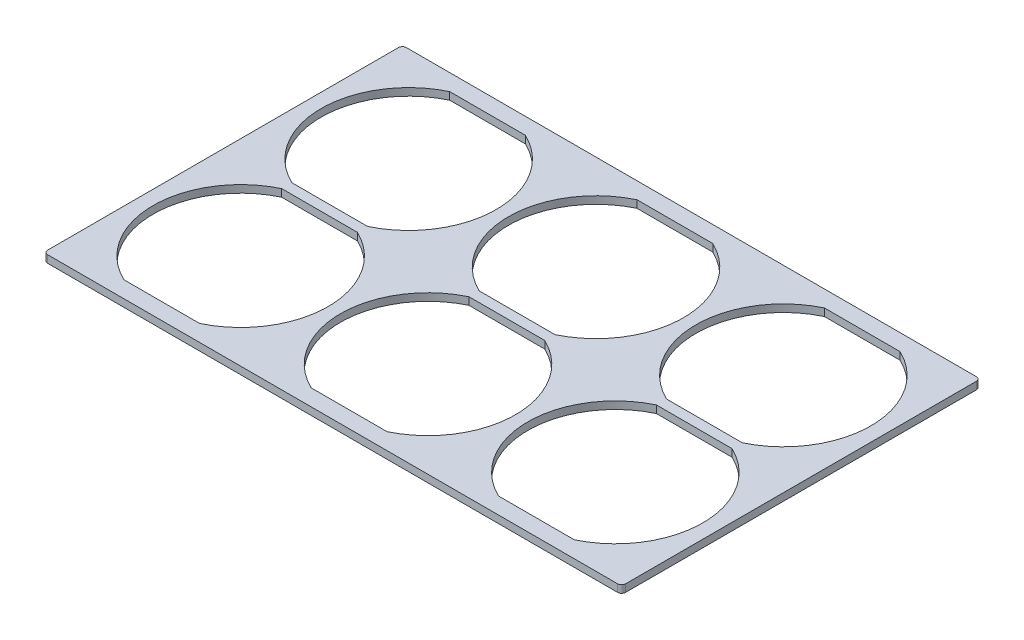
ISO-10303-21;
HEADER;
FILE_DESCRIPTION(('STEP AP214'),'2;1');
FILE_NAME('part.step','',(''),(''),'','','');
FILE_SCHEMA(('AUTOMOTIVE_DESIGN { 1 0 10303 214 1 1 1 1 }'));
ENDSEC;
DATA;
#1=APPLICATION_CONTEXT('core data for automotive mechanical design processes');
#2=APPLICATION_PROTOCOL_DEFINITION('international standard','automotive_design',2000,#1);
#3=PRODUCT_CONTEXT('',#1,'mechanical');
#4=PRODUCT('Part','Part','',(#3));
#5=PRODUCT_RELATED_PRODUCT_CATEGORY('part','',(#4));
#6=PRODUCT_DEFINITION_FORMATION('','',#4);
#7=PRODUCT_DEFINITION_CONTEXT('part definition',#1,'design');
#8=PRODUCT_DEFINITION('design','',#6,#7);
#9=PRODUCT_DEFINITION_SHAPE('','',#8);
#10=(LENGTH_UNIT() NAMED_UNIT(*) SI_UNIT(.MILLI.,.METRE.));
#11=(NAMED_UNIT(*) PLANE_ANGLE_UNIT() SI_UNIT($,.RADIAN.));
#12=(NAMED_UNIT(*) SI_UNIT($,.STERADIAN.) SOLID_ANGLE_UNIT());
#13=UNCERTAINTY_MEASURE_WITH_UNIT(LENGTH_MEASURE(1.E-05),#10,'distance_accuracy_value','');
#14=(GEOMETRIC_REPRESENTATION_CONTEXT(3) GLOBAL_UNCERTAINTY_ASSIGNED_CONTEXT((#13)) GLOBAL_UNIT_ASSIGNED_CONTEXT((#10,
#11,#12)) REPRESENTATION_CONTEXT('',''));
#15=CARTESIAN_POINT('',(0.,0.,0.));
#16=DIRECTION('',(0.,0.,1.));
#17=DIRECTION('',(1.,0.,0.));
#18=AXIS2_PLACEMENT_3D('',#15,#16,#17);
#19=CARTESIAN_POINT('',(184.15,4.7625,114.3));
#20=DIRECTION('',(-1.,0.,0.));
#21=DIRECTION('',(0.,0.,1.));
#22=AXIS2_PLACEMENT_3D('',#19,#20,#21);
#23=PLANE('',#22);
#24=DIRECTION('',(0.,0.,-1.));
#25=VECTOR('',#24,1.);
#26=CARTESIAN_POINT('',(184.15,4.7625,114.3));
#27=LINE('',#26,#25);
#28=CARTESIAN_POINT('',(184.15,4.7625,111.76));
#29=VERTEX_POINT('',#28);
#30=CARTESIAN_POINT('',(184.15,4.7625,-111.76));
#31=VERTEX_POINT('',#30);
#32=EDGE_CURVE('E447',#29,#31,#27,.T.);
#33=ORIENTED_EDGE('',*,*,#32,.F.);
#34=DIRECTION('',(0.,-1.,0.));
#35=VECTOR('',#34,1.);
#36=CARTESIAN_POINT('',(184.15,4.7625,111.76));
#37=LINE('',#36,#35);
#38=CARTESIAN_POINT('',(184.15,0.,111.76));
#39=VERTEX_POINT('',#38);
#40=EDGE_CURVE('E494',#29,#39,#37,.T.);
#41=ORIENTED_EDGE('',*,*,#40,.T.);
#42=DIRECTION('',(0.,0.,-1.));
#43=VECTOR('',#42,1.);
#44=CARTESIAN_POINT('',(184.15,0.,114.3));
#45=LINE('',#44,#43);
#46=CARTESIAN_POINT('',(184.15,0.,-111.76));
#47=VERTEX_POINT('',#46);
#48=EDGE_CURVE('E440',#39,#47,#45,.T.);
#49=ORIENTED_EDGE('',*,*,#48,.T.);
#50=DIRECTION('',(0.,-1.,0.));
#51=VECTOR('',#50,1.);
#52=CARTESIAN_POINT('',(184.15,4.7625,-111.76));
#53=LINE('',#52,#51);
#54=EDGE_CURVE('E492',#47,#31,#53,.F.);
#55=ORIENTED_EDGE('',*,*,#54,.T.);
#56=EDGE_LOOP('',(#33,#41,#49,#55));
#57=FACE_BOUND('',#56,.T.);
#58=ADVANCED_FACE('F33',(#57),#23,.F.);
#59=CARTESIAN_POINT('',(-184.15,4.7625,-114.3));
#60=DIRECTION('',(0.,0.,1.));
#61=DIRECTION('',(1.,0.,0.));
#62=AXIS2_PLACEMENT_3D('',#59,#60,#61);
#63=PLANE('',#62);
#64=DIRECTION('',(-1.,0.,0.));
#65=VECTOR('',#64,1.);
#66=CARTESIAN_POINT('',(-184.15,4.7625,-114.3));
#67=LINE('',#66,#65);
#68=CARTESIAN_POINT('',(181.61,4.7625,-114.3));
#69=VERTEX_POINT('',#68);
#70=CARTESIAN_POINT('',(-181.61,4.7625,-114.3));
#71=VERTEX_POINT('',#70);
#72=EDGE_CURVE('E449',#69,#71,#67,.T.);
#73=ORIENTED_EDGE('',*,*,#72,.F.);
#74=DIRECTION('',(0.,-1.,0.));
#75=VECTOR('',#74,1.);
#76=CARTESIAN_POINT('',(181.61,4.7625,-114.3));
#77=LINE('',#76,#75);
#78=CARTESIAN_POINT('',(181.61,0.,-114.3));
#79=VERTEX_POINT('',#78);
#80=EDGE_CURVE('E11',#69,#79,#77,.T.);
#81=ORIENTED_EDGE('',*,*,#80,.T.);
#82=DIRECTION('',(-1.,0.,0.));
#83=VECTOR('',#82,1.);
#84=CARTESIAN_POINT('',(-184.15,0.,-114.3));
#85=LINE('',#84,#83);
#86=CARTESIAN_POINT('',(-181.61,0.,-114.3));
#87=VERTEX_POINT('',#86);
#88=EDGE_CURVE('E461',#79,#87,#85,.T.);
#89=ORIENTED_EDGE('',*,*,#88,.T.);
#90=DIRECTION('',(0.,-1.,0.));
#91=VECTOR('',#90,1.);
#92=CARTESIAN_POINT('',(-181.61,4.7625,-114.3));
#93=LINE('',#92,#91);
#94=EDGE_CURVE('E41',#87,#71,#93,.F.);
#95=ORIENTED_EDGE('',*,*,#94,.T.);
#96=EDGE_LOOP('',(#73,#81,#89,#95));
#97=FACE_BOUND('',#96,.T.);
#98=ADVANCED_FACE('F510',(#97),#63,.F.);
#99=CARTESIAN_POINT('',(-184.15,4.7625,114.3));
#100=DIRECTION('',(1.,0.,0.));
#101=DIRECTION('',(0.,0.,-1.));
#102=AXIS2_PLACEMENT_3D('',#99,#100,#101);
#103=PLANE('',#102);
#104=DIRECTION('',(0.,0.,1.));
#105=VECTOR('',#104,1.);
#106=CARTESIAN_POINT('',(-184.15,0.,114.3));
#107=LINE('',#106,#105);
#108=CARTESIAN_POINT('',(-184.15,0.,-111.76));
#109=VERTEX_POINT('',#108);
#110=CARTESIAN_POINT('',(-184.15,0.,111.76));
#111=VERTEX_POINT('',#110);
#112=EDGE_CURVE('E463',#109,#111,#107,.T.);
#113=ORIENTED_EDGE('',*,*,#112,.T.);
#114=DIRECTION('',(0.,-1.,0.));
#115=VECTOR('',#114,1.);
#116=CARTESIAN_POINT('',(-184.15,4.7625,111.76));
#117=LINE('',#116,#115);
#118=CARTESIAN_POINT('',(-184.15,4.7625,111.76));
#119=VERTEX_POINT('',#118);
#120=EDGE_CURVE('E483',#111,#119,#117,.F.);
#121=ORIENTED_EDGE('',*,*,#120,.T.);
#122=DIRECTION('',(0.,0.,1.));
#123=VECTOR('',#122,1.);
#124=CARTESIAN_POINT('',(-184.15,4.7625,114.3));
#125=LINE('',#124,#123);
#126=CARTESIAN_POINT('',(-184.15,4.7625,-111.76));
#127=VERTEX_POINT('',#126);
#128=EDGE_CURVE('E452',#127,#119,#125,.T.);
#129=ORIENTED_EDGE('',*,*,#128,.F.);
#130=DIRECTION('',(0.,-1.,0.));
#131=VECTOR('',#130,1.);
#132=CARTESIAN_POINT('',(-184.15,4.7625,-111.76));
#133=LINE('',#132,#131);
#134=EDGE_CURVE('E480',#127,#109,#133,.T.);
#135=ORIENTED_EDGE('',*,*,#134,.T.);
#136=EDGE_LOOP('',(#113,#121,#129,#135));
#137=FACE_BOUND('',#136,.T.);
#138=ADVANCED_FACE('F517',(#137),#103,.F.);
#139=CARTESIAN_POINT('',(-184.15,4.7625,114.3));
#140=DIRECTION('',(0.,0.,-1.));
#141=DIRECTION('',(-1.,0.,0.));
#142=AXIS2_PLACEMENT_3D('',#139,#140,#141);
#143=PLANE('',#142);
#144=DIRECTION('',(1.,0.,0.));
#145=VECTOR('',#144,1.);
#146=CARTESIAN_POINT('',(-184.15,4.7625,114.3));
#147=LINE('',#146,#145);
#148=CARTESIAN_POINT('',(-181.61,4.7625,114.3));
#149=VERTEX_POINT('',#148);
#150=CARTESIAN_POINT('',(181.61,4.7625,114.3));
#151=VERTEX_POINT('',#150);
#152=EDGE_CURVE('E455',#149,#151,#147,.T.);
#153=ORIENTED_EDGE('',*,*,#152,.F.);
#154=DIRECTION('',(0.,-1.,0.));
#155=VECTOR('',#154,1.);
#156=CARTESIAN_POINT('',(-181.61,4.7625,114.3));
#157=LINE('',#156,#155);
#158=CARTESIAN_POINT('',(-181.61,0.,114.3));
#159=VERTEX_POINT('',#158);
#160=EDGE_CURVE('E469',#149,#159,#157,.T.);
#161=ORIENTED_EDGE('',*,*,#160,.T.);
#162=DIRECTION('',(1.,0.,0.));
#163=VECTOR('',#162,1.);
#164=CARTESIAN_POINT('',(-184.15,0.,114.3));
#165=LINE('',#164,#163);
#166=CARTESIAN_POINT('',(181.61,0.,114.3));
#167=VERTEX_POINT('',#166);
#168=EDGE_CURVE('E450',#159,#167,#165,.T.);
#169=ORIENTED_EDGE('',*,*,#168,.T.);
#170=DIRECTION('',(0.,-1.,0.));
#171=VECTOR('',#170,1.);
#172=CARTESIAN_POINT('',(181.61,4.7625,114.3));
#173=LINE('',#172,#171);
#174=EDGE_CURVE('E458',#167,#151,#173,.F.);
#175=ORIENTED_EDGE('',*,*,#174,.T.);
#176=EDGE_LOOP('',(#153,#161,#169,#175));
#177=FACE_BOUND('',#176,.T.);
#178=ADVANCED_FACE('F525',(#177),#143,.F.);
#179=CARTESIAN_POINT('',(0.,4.7625,0.));
#180=DIRECTION('',(0.,-1.,0.));
#181=DIRECTION('',(0.,0.,-1.));
#182=AXIS2_PLACEMENT_3D('',#179,#180,#181);
#183=PLANE('',#182);
#184=DIRECTION('',(-1.,0.,0.));
#185=VECTOR('',#184,1.);
#186=CARTESIAN_POINT('',(-95.2266255193019,4.7625,-3.24545465410517));
#187=LINE('',#186,#185);
#188=CARTESIAN_POINT('',(-95.2266255193019,4.7625,-3.24545465410517));
#189=VERTEX_POINT('',#188);
#190=CARTESIAN_POINT('',(-143.533374480698,4.7625,-3.24545465410517));
#191=VERTEX_POINT('',#190);
#192=EDGE_CURVE('E362',#189,#191,#187,.T.);
#193=ORIENTED_EDGE('',*,*,#192,.T.);
#194=CARTESIAN_POINT('',(-119.38,4.7625,-53.5305000000017));
#195=DIRECTION('',(0.,-1.,0.));
#196=DIRECTION('',(0.,0.,-1.));
#197=AXIS2_PLACEMENT_3D('',#194,#195,#196);
#198=CIRCLE('',#197,55.7850453458963);
#199=CARTESIAN_POINT('',(-143.533374480698,4.7625,-103.815545345898));
#200=VERTEX_POINT('',#199);
#201=EDGE_CURVE('E352',#191,#200,#198,.T.);
#202=ORIENTED_EDGE('',*,*,#201,.T.);
#203=DIRECTION('',(1.,0.,0.));
#204=VECTOR('',#203,1.);
#205=CARTESIAN_POINT('',(-95.2266255193019,4.7625,-103.815545345898));
#206=LINE('',#205,#204);
#207=CARTESIAN_POINT('',(-95.2266255193019,4.7625,-103.815545345898));
#208=VERTEX_POINT('',#207);
#209=EDGE_CURVE('E355',#200,#208,#206,.T.);
#210=ORIENTED_EDGE('',*,*,#209,.T.);
#211=CARTESIAN_POINT('',(-119.38,4.7625,-53.5305000000017));
#212=DIRECTION('',(0.,-1.,0.));
#213=DIRECTION('',(0.,0.,-1.));
#214=AXIS2_PLACEMENT_3D('',#211,#212,#213);
#215=CIRCLE('',#214,55.7850453458963);
#216=EDGE_CURVE('E359',#208,#189,#215,.T.);
#217=ORIENTED_EDGE('',*,*,#216,.T.);
#218=EDGE_LOOP('',(#193,#202,#210,#217));
#219=FACE_BOUND('',#218,.T.);
#220=DIRECTION('',(-1.,0.,0.));
#221=VECTOR('',#220,1.);
#222=CARTESIAN_POINT('',(24.1533744806981,4.7625,-3.24545465410433));
#223=LINE('',#222,#221);
#224=CARTESIAN_POINT('',(24.1533744806981,4.7625,-3.24545465410434));
#225=VERTEX_POINT('',#224);
#226=CARTESIAN_POINT('',(-24.1533744806982,4.7625,-3.24545465410433));
#227=VERTEX_POINT('',#226);
#228=EDGE_CURVE('E330',#225,#227,#223,.T.);
#229=ORIENTED_EDGE('',*,*,#228,.T.);
#230=CARTESIAN_POINT('',(0.,4.7625,-53.5305000000008));
#231=DIRECTION('',(0.,-1.,0.));
#232=DIRECTION('',(0.,0.,-1.));
#233=AXIS2_PLACEMENT_3D('',#230,#231,#232);
#234=CIRCLE('',#233,55.7850453458963);
#235=CARTESIAN_POINT('',(-24.1533744806982,4.7625,-103.815545345897));
#236=VERTEX_POINT('',#235);
#237=EDGE_CURVE('E320',#227,#236,#234,.T.);
#238=ORIENTED_EDGE('',*,*,#237,.T.);
#239=DIRECTION('',(1.,0.,0.));
#240=VECTOR('',#239,1.);
#241=CARTESIAN_POINT('',(24.1533744806981,4.7625,-103.815545345897));
#242=LINE('',#241,#240);
#243=CARTESIAN_POINT('',(24.1533744806981,4.7625,-103.815545345897));
#244=VERTEX_POINT('',#243);
#245=EDGE_CURVE('E323',#236,#244,#242,.T.);
#246=ORIENTED_EDGE('',*,*,#245,.T.);
#247=CARTESIAN_POINT('',(0.,4.7625,-53.5305000000008));
#248=DIRECTION('',(0.,-1.,0.));
#249=DIRECTION('',(0.,0.,-1.));
#250=AXIS2_PLACEMENT_3D('',#247,#248,#249);
#251=CIRCLE('',#250,55.7850453458963);
#252=EDGE_CURVE('E327',#244,#225,#251,.T.);
#253=ORIENTED_EDGE('',*,*,#252,.T.);
#254=EDGE_LOOP('',(#229,#238,#246,#253));
#255=FACE_BOUND('',#254,.T.);
#256=DIRECTION('',(-1.,0.,0.));
#257=VECTOR('',#256,1.);
#258=CARTESIAN_POINT('',(-95.2266255193018,4.7625,103.815545345896));
#259=LINE('',#258,#257);
#260=CARTESIAN_POINT('',(-95.2266255193018,4.7625,103.815545345896));
#261=VERTEX_POINT('',#260);
#262=CARTESIAN_POINT('',(-143.533374480698,4.7625,103.815545345896));
#263=VERTEX_POINT('',#262);
#264=EDGE_CURVE('E298',#261,#263,#259,.T.);
#265=ORIENTED_EDGE('',*,*,#264,.T.);
#266=CARTESIAN_POINT('',(-119.38,4.7625,53.5304999999991));
#267=DIRECTION('',(0.,-1.,0.));
#268=DIRECTION('',(0.,0.,-1.));
#269=AXIS2_PLACEMENT_3D('',#266,#267,#268);
#270=CIRCLE('',#269,55.7850453458963);
#271=CARTESIAN_POINT('',(-143.533374480698,4.7625,3.24545465410263));
#272=VERTEX_POINT('',#271);
#273=EDGE_CURVE('E288',#263,#272,#270,.T.);
#274=ORIENTED_EDGE('',*,*,#273,.T.);
#275=DIRECTION('',(1.,0.,0.));
#276=VECTOR('',#275,1.);
#277=CARTESIAN_POINT('',(-95.2266255193018,4.7625,3.24545465410263));
#278=LINE('',#277,#276);
#279=CARTESIAN_POINT('',(-95.2266255193018,4.7625,3.24545465410263));
#280=VERTEX_POINT('',#279);
#281=EDGE_CURVE('E291',#272,#280,#278,.T.);
#282=ORIENTED_EDGE('',*,*,#281,.T.);
#283=CARTESIAN_POINT('',(-119.38,4.7625,53.5304999999991));
#284=DIRECTION('',(0.,-1.,0.));
#285=DIRECTION('',(0.,0.,-1.));
#286=AXIS2_PLACEMENT_3D('',#283,#284,#285);
#287=CIRCLE('',#286,55.7850453458963);
#288=EDGE_CURVE('E295',#280,#261,#287,.T.);
#289=ORIENTED_EDGE('',*,*,#288,.T.);
#290=EDGE_LOOP('',(#265,#274,#282,#289));
#291=FACE_BOUND('',#290,.T.);
#292=DIRECTION('',(-1.,0.,0.));
#293=VECTOR('',#292,1.);
#294=CARTESIAN_POINT('',(24.1533744806981,4.7625,103.815545345896));
#295=LINE('',#294,#293);
#296=CARTESIAN_POINT('',(24.1533744806981,4.7625,103.815545345896));
#297=VERTEX_POINT('',#296);
#298=CARTESIAN_POINT('',(-24.1533744806982,4.7625,103.815545345896));
#299=VERTEX_POINT('',#298);
#300=EDGE_CURVE('E255',#297,#299,#295,.T.);
#301=ORIENTED_EDGE('',*,*,#300,.T.);
#302=CARTESIAN_POINT('',(0.,4.7625,53.5304999999992));
#303=DIRECTION('',(0.,-1.,0.));
#304=DIRECTION('',(0.,0.,-1.));
#305=AXIS2_PLACEMENT_3D('',#302,#303,#304);
#306=CIRCLE('',#305,55.7850453458963);
#307=CARTESIAN_POINT('',(-24.1533744806982,4.7625,3.24545465410268));
#308=VERTEX_POINT('',#307);
#309=EDGE_CURVE('E247',#299,#308,#306,.T.);
#310=ORIENTED_EDGE('',*,*,#309,.T.);
#311=DIRECTION('',(1.,0.,0.));
#312=VECTOR('',#311,1.);
#313=CARTESIAN_POINT('',(24.1533744806981,4.7625,3.24545465410268));
#314=LINE('',#313,#312);
#315=CARTESIAN_POINT('',(24.1533744806981,4.7625,3.24545465410268));
#316=VERTEX_POINT('',#315);
#317=EDGE_CURVE('E259',#308,#316,#314,.T.);
#318=ORIENTED_EDGE('',*,*,#317,.T.);
#319=CARTESIAN_POINT('',(0.,4.7625,53.5304999999992));
#320=DIRECTION('',(0.,-1.,0.));
#321=DIRECTION('',(0.,0.,-1.));
#322=AXIS2_PLACEMENT_3D('',#319,#320,#321);
#323=CIRCLE('',#322,55.7850453458963);
#324=EDGE_CURVE('E263',#316,#297,#323,.T.);
#325=ORIENTED_EDGE('',*,*,#324,.T.);
#326=EDGE_LOOP('',(#301,#310,#318,#325));
#327=FACE_BOUND('',#326,.T.);
#328=DIRECTION('',(-1.,0.,0.));
#329=VECTOR('',#328,1.);
#330=CARTESIAN_POINT('',(143.533374480698,4.7625,103.815545345896));
#331=LINE('',#330,#329);
#332=CARTESIAN_POINT('',(143.533374480698,4.7625,103.815545345896));
#333=VERTEX_POINT('',#332);
#334=CARTESIAN_POINT('',(95.2266255193018,4.7625,103.815545345896));
#335=VERTEX_POINT('',#334);
#336=EDGE_CURVE('E393',#333,#335,#331,.T.);
#337=ORIENTED_EDGE('',*,*,#336,.T.);
#338=CARTESIAN_POINT('',(119.38,4.7625,53.5305));
#339=DIRECTION('',(0.,-1.,0.));
#340=DIRECTION('',(0.,0.,-1.));
#341=AXIS2_PLACEMENT_3D('',#338,#339,#340);
#342=CIRCLE('',#341,55.7850453458963);
#343=CARTESIAN_POINT('',(95.2266255193018,4.7625,3.24545465410352));
#344=VERTEX_POINT('',#343);
#345=EDGE_CURVE('E383',#335,#344,#342,.T.);
#346=ORIENTED_EDGE('',*,*,#345,.T.);
#347=DIRECTION('',(1.,0.,0.));
#348=VECTOR('',#347,1.);
#349=CARTESIAN_POINT('',(143.533374480698,4.7625,3.24545465410352));
#350=LINE('',#349,#348);
#351=CARTESIAN_POINT('',(143.533374480698,4.7625,3.24545465410352));
#352=VERTEX_POINT('',#351);
#353=EDGE_CURVE('E386',#344,#352,#350,.T.);
#354=ORIENTED_EDGE('',*,*,#353,.T.);
#355=CARTESIAN_POINT('',(119.38,4.7625,53.5305));
#356=DIRECTION('',(0.,-1.,0.));
#357=DIRECTION('',(0.,0.,-1.));
#358=AXIS2_PLACEMENT_3D('',#355,#356,#357);
#359=CIRCLE('',#358,55.7850453458963);
#360=EDGE_CURVE('E390',#352,#333,#359,.T.);
#361=ORIENTED_EDGE('',*,*,#360,.T.);
#362=EDGE_LOOP('',(#337,#346,#354,#361));
#363=FACE_BOUND('',#362,.T.);
#364=DIRECTION('',(-1.,0.,0.));
#365=VECTOR('',#364,1.);
#366=CARTESIAN_POINT('',(143.533374480698,4.7625,-3.24545465410434));
#367=LINE('',#366,#365);
#368=CARTESIAN_POINT('',(143.533374480698,4.7625,-3.24545465410435));
#369=VERTEX_POINT('',#368);
#370=CARTESIAN_POINT('',(95.2266255193014,4.7625,-3.24545465410434));
#371=VERTEX_POINT('',#370);
#372=EDGE_CURVE('E425',#369,#371,#367,.T.);
#373=ORIENTED_EDGE('',*,*,#372,.T.);
#374=CARTESIAN_POINT('',(119.38,4.7625,-53.5305000000008));
#375=DIRECTION('',(0.,-1.,0.));
#376=DIRECTION('',(0.,0.,-1.));
#377=AXIS2_PLACEMENT_3D('',#374,#375,#376);
#378=CIRCLE('',#377,55.7850453458963);
#379=CARTESIAN_POINT('',(95.2266255193014,4.7625,-103.815545345897));
#380=VERTEX_POINT('',#379);
#381=EDGE_CURVE('E415',#371,#380,#378,.T.);
#382=ORIENTED_EDGE('',*,*,#381,.T.);
#383=DIRECTION('',(1.,0.,0.));
#384=VECTOR('',#383,1.);
#385=CARTESIAN_POINT('',(143.533374480698,4.7625,-103.815545345897));
#386=LINE('',#385,#384);
#387=CARTESIAN_POINT('',(143.533374480698,4.7625,-103.815545345897));
#388=VERTEX_POINT('',#387);
#389=EDGE_CURVE('E418',#380,#388,#386,.T.);
#390=ORIENTED_EDGE('',*,*,#389,.T.);
#391=CARTESIAN_POINT('',(119.38,4.7625,-53.5305000000008));
#392=DIRECTION('',(0.,-1.,0.));
#393=DIRECTION('',(0.,0.,-1.));
#394=AXIS2_PLACEMENT_3D('',#391,#392,#393);
#395=CIRCLE('',#394,55.7850453458963);
#396=EDGE_CURVE('E422',#388,#369,#395,.T.);
#397=ORIENTED_EDGE('',*,*,#396,.T.);
#398=EDGE_LOOP('',(#373,#382,#390,#397));
#399=FACE_BOUND('',#398,.T.);
#400=ORIENTED_EDGE('',*,*,#128,.T.);
#401=CARTESIAN_POINT('',(-181.61,4.7625,111.76));
#402=DIRECTION('',(0.,-1.,0.));
#403=DIRECTION('',(0.,0.,-1.));
#404=AXIS2_PLACEMENT_3D('',#401,#402,#403);
#405=CIRCLE('',#404,2.54);
#406=EDGE_CURVE('E490',#119,#149,#405,.F.);
#407=ORIENTED_EDGE('',*,*,#406,.T.);
#408=ORIENTED_EDGE('',*,*,#152,.T.);
#409=CARTESIAN_POINT('',(181.61,4.7625,111.76));
#410=DIRECTION('',(0.,-1.,0.));
#411=DIRECTION('',(0.,0.,-1.));
#412=AXIS2_PLACEMENT_3D('',#409,#410,#411);
#413=CIRCLE('',#412,2.54);
#414=EDGE_CURVE('E488',#151,#29,#413,.F.);
#415=ORIENTED_EDGE('',*,*,#414,.T.);
#416=ORIENTED_EDGE('',*,*,#32,.T.);
#417=CARTESIAN_POINT('',(181.61,4.7625,-111.76));
#418=DIRECTION('',(0.,-1.,0.));
#419=DIRECTION('',(0.,0.,-1.));
#420=AXIS2_PLACEMENT_3D('',#417,#418,#419);
#421=CIRCLE('',#420,2.54);
#422=EDGE_CURVE('E54',#31,#69,#421,.F.);
#423=ORIENTED_EDGE('',*,*,#422,.T.);
#424=ORIENTED_EDGE('',*,*,#72,.T.);
#425=CARTESIAN_POINT('',(-181.61,4.7625,-111.76));
#426=DIRECTION('',(0.,-1.,0.));
#427=DIRECTION('',(0.,0.,-1.));
#428=AXIS2_PLACEMENT_3D('',#425,#426,#427);
#429=CIRCLE('',#428,2.54);
#430=EDGE_CURVE('E485',#71,#127,#429,.F.);
#431=ORIENTED_EDGE('',*,*,#430,.T.);
#432=EDGE_LOOP('',(#400,#407,#408,#415,#416,#423,#424,#431));
#433=FACE_BOUND('',#432,.T.);
#434=ADVANCED_FACE('F265',(#219,#255,#291,#327,#363,#399,#433),#183,.F.);
#435=CARTESIAN_POINT('',(0.,0.,0.));
#436=DIRECTION('',(0.,-1.,0.));
#437=DIRECTION('',(0.,0.,-1.));
#438=AXIS2_PLACEMENT_3D('',#435,#436,#437);
#439=PLANE('',#438);
#440=CARTESIAN_POINT('',(-119.38,0.,-53.5305000000017));
#441=DIRECTION('',(0.,-1.,0.));
#442=DIRECTION('',(0.,0.,-1.));
#443=AXIS2_PLACEMENT_3D('',#440,#441,#442);
#444=CIRCLE('',#443,55.7850453458963);
#445=CARTESIAN_POINT('',(-143.533374480698,0.,-3.24545465410517));
#446=VERTEX_POINT('',#445);
#447=CARTESIAN_POINT('',(-143.533374480698,0.,-103.815545345898));
#448=VERTEX_POINT('',#447);
#449=EDGE_CURVE('E366',#446,#448,#444,.T.);
#450=ORIENTED_EDGE('',*,*,#449,.F.);
#451=DIRECTION('',(-1.,0.,0.));
#452=VECTOR('',#451,1.);
#453=CARTESIAN_POINT('',(-95.2266255193019,0.,-3.24545465410517));
#454=LINE('',#453,#452);
#455=CARTESIAN_POINT('',(-95.2266255193019,0.,-3.24545465410517));
#456=VERTEX_POINT('',#455);
#457=EDGE_CURVE('E356',#456,#446,#454,.T.);
#458=ORIENTED_EDGE('',*,*,#457,.F.);
#459=CARTESIAN_POINT('',(-119.38,0.,-53.5305000000017));
#460=DIRECTION('',(0.,-1.,0.));
#461=DIRECTION('',(0.,0.,-1.));
#462=AXIS2_PLACEMENT_3D('',#459,#460,#461);
#463=CIRCLE('',#462,55.7850453458963);
#464=CARTESIAN_POINT('',(-95.2266255193019,0.,-103.815545345898));
#465=VERTEX_POINT('',#464);
#466=EDGE_CURVE('E371',#465,#456,#463,.T.);
#467=ORIENTED_EDGE('',*,*,#466,.F.);
#468=DIRECTION('',(1.,0.,0.));
#469=VECTOR('',#468,1.);
#470=CARTESIAN_POINT('',(-95.2266255193019,0.,-103.815545345898));
#471=LINE('',#470,#469);
#472=EDGE_CURVE('E368',#448,#465,#471,.T.);
#473=ORIENTED_EDGE('',*,*,#472,.F.);
#474=EDGE_LOOP('',(#450,#458,#467,#473));
#475=FACE_BOUND('',#474,.T.);
#476=CARTESIAN_POINT('',(0.,0.,-53.5305000000008));
#477=DIRECTION('',(0.,-1.,0.));
#478=DIRECTION('',(0.,0.,-1.));
#479=AXIS2_PLACEMENT_3D('',#476,#477,#478);
#480=CIRCLE('',#479,55.7850453458963);
#481=CARTESIAN_POINT('',(-24.1533744806982,0.,-3.24545465410433));
#482=VERTEX_POINT('',#481);
#483=CARTESIAN_POINT('',(-24.1533744806982,0.,-103.815545345897));
#484=VERTEX_POINT('',#483);
#485=EDGE_CURVE('E334',#482,#484,#480,.T.);
#486=ORIENTED_EDGE('',*,*,#485,.F.);
#487=DIRECTION('',(-1.,0.,0.));
#488=VECTOR('',#487,1.);
#489=CARTESIAN_POINT('',(24.1533744806981,0.,-3.24545465410433));
#490=LINE('',#489,#488);
#491=CARTESIAN_POINT('',(24.1533744806981,0.,-3.24545465410434));
#492=VERTEX_POINT('',#491);
#493=EDGE_CURVE('E324',#492,#482,#490,.T.);
#494=ORIENTED_EDGE('',*,*,#493,.F.);
#495=CARTESIAN_POINT('',(0.,0.,-53.5305000000008));
#496=DIRECTION('',(0.,-1.,0.));
#497=DIRECTION('',(0.,0.,-1.));
#498=AXIS2_PLACEMENT_3D('',#495,#496,#497);
#499=CIRCLE('',#498,55.7850453458963);
#500=CARTESIAN_POINT('',(24.1533744806981,0.,-103.815545345897));
#501=VERTEX_POINT('',#500);
#502=EDGE_CURVE('E340',#501,#492,#499,.T.);
#503=ORIENTED_EDGE('',*,*,#502,.F.);
#504=DIRECTION('',(1.,0.,0.));
#505=VECTOR('',#504,1.);
#506=CARTESIAN_POINT('',(24.1533744806981,0.,-103.815545345897));
#507=LINE('',#506,#505);
#508=EDGE_CURVE('E336',#484,#501,#507,.T.);
#509=ORIENTED_EDGE('',*,*,#508,.F.);
#510=EDGE_LOOP('',(#486,#494,#503,#509));
#511=FACE_BOUND('',#510,.T.);
#512=CARTESIAN_POINT('',(-119.38,0.,53.5304999999991));
#513=DIRECTION('',(0.,-1.,0.));
#514=DIRECTION('',(0.,0.,-1.));
#515=AXIS2_PLACEMENT_3D('',#512,#513,#514);
#516=CIRCLE('',#515,55.7850453458963);
#517=CARTESIAN_POINT('',(-143.533374480698,0.,103.815545345896));
#518=VERTEX_POINT('',#517);
#519=CARTESIAN_POINT('',(-143.533374480698,0.,3.24545465410263));
#520=VERTEX_POINT('',#519);
#521=EDGE_CURVE('E302',#518,#520,#516,.T.);
#522=ORIENTED_EDGE('',*,*,#521,.F.);
#523=DIRECTION('',(-1.,0.,0.));
#524=VECTOR('',#523,1.);
#525=CARTESIAN_POINT('',(-95.2266255193018,0.,103.815545345896));
#526=LINE('',#525,#524);
#527=CARTESIAN_POINT('',(-95.2266255193018,0.,103.815545345896));
#528=VERTEX_POINT('',#527);
#529=EDGE_CURVE('E292',#528,#518,#526,.T.);
#530=ORIENTED_EDGE('',*,*,#529,.F.);
#531=CARTESIAN_POINT('',(-119.38,0.,53.5304999999991));
#532=DIRECTION('',(0.,-1.,0.));
#533=DIRECTION('',(0.,0.,-1.));
#534=AXIS2_PLACEMENT_3D('',#531,#532,#533);
#535=CIRCLE('',#534,55.7850453458963);
#536=CARTESIAN_POINT('',(-95.2266255193018,0.,3.24545465410263));
#537=VERTEX_POINT('',#536);
#538=EDGE_CURVE('E308',#537,#528,#535,.T.);
#539=ORIENTED_EDGE('',*,*,#538,.F.);
#540=DIRECTION('',(1.,0.,0.));
#541=VECTOR('',#540,1.);
#542=CARTESIAN_POINT('',(-95.2266255193018,0.,3.24545465410263));
#543=LINE('',#542,#541);
#544=EDGE_CURVE('E304',#520,#537,#543,.T.);
#545=ORIENTED_EDGE('',*,*,#544,.F.);
#546=EDGE_LOOP('',(#522,#530,#539,#545));
#547=FACE_BOUND('',#546,.T.);
#548=CARTESIAN_POINT('',(0.,0.,53.5304999999992));
#549=DIRECTION('',(0.,-1.,0.));
#550=DIRECTION('',(0.,0.,-1.));
#551=AXIS2_PLACEMENT_3D('',#548,#549,#550);
#552=CIRCLE('',#551,55.7850453458963);
#553=CARTESIAN_POINT('',(-24.1533744806982,0.,103.815545345896));
#554=VERTEX_POINT('',#553);
#555=CARTESIAN_POINT('',(-24.1533744806982,0.,3.24545465410268));
#556=VERTEX_POINT('',#555);
#557=EDGE_CURVE('E250',#554,#556,#552,.T.);
#558=ORIENTED_EDGE('',*,*,#557,.F.);
#559=DIRECTION('',(-1.,0.,0.));
#560=VECTOR('',#559,1.);
#561=CARTESIAN_POINT('',(24.1533744806981,0.,103.815545345896));
#562=LINE('',#561,#560);
#563=CARTESIAN_POINT('',(24.1533744806981,0.,103.815545345896));
#564=VERTEX_POINT('',#563);
#565=EDGE_CURVE('E268',#564,#554,#562,.T.);
#566=ORIENTED_EDGE('',*,*,#565,.F.);
#567=CARTESIAN_POINT('',(0.,0.,53.5304999999992));
#568=DIRECTION('',(0.,-1.,0.));
#569=DIRECTION('',(0.,0.,-1.));
#570=AXIS2_PLACEMENT_3D('',#567,#568,#569);
#571=CIRCLE('',#570,55.7850453458963);
#572=CARTESIAN_POINT('',(24.1533744806981,0.,3.24545465410268));
#573=VERTEX_POINT('',#572);
#574=EDGE_CURVE('E271',#573,#564,#571,.T.);
#575=ORIENTED_EDGE('',*,*,#574,.F.);
#576=DIRECTION('',(1.,0.,0.));
#577=VECTOR('',#576,1.);
#578=CARTESIAN_POINT('',(24.1533744806981,0.,3.24545465410268));
#579=LINE('',#578,#577);
#580=EDGE_CURVE('E277',#556,#573,#579,.T.);
#581=ORIENTED_EDGE('',*,*,#580,.F.);
#582=EDGE_LOOP('',(#558,#566,#575,#581));
#583=FACE_BOUND('',#582,.T.);
#584=CARTESIAN_POINT('',(119.38,0.,53.5305));
#585=DIRECTION('',(0.,-1.,0.));
#586=DIRECTION('',(0.,0.,-1.));
#587=AXIS2_PLACEMENT_3D('',#584,#585,#586);
#588=CIRCLE('',#587,55.7850453458963);
#589=CARTESIAN_POINT('',(95.2266255193018,0.,103.815545345896));
#590=VERTEX_POINT('',#589);
#591=CARTESIAN_POINT('',(95.2266255193018,0.,3.24545465410352));
#592=VERTEX_POINT('',#591);
#593=EDGE_CURVE('E284',#590,#592,#588,.T.);
#594=ORIENTED_EDGE('',*,*,#593,.F.);
#595=DIRECTION('',(-1.,0.,0.));
#596=VECTOR('',#595,1.);
#597=CARTESIAN_POINT('',(143.533374480698,0.,103.815545345896));
#598=LINE('',#597,#596);
#599=CARTESIAN_POINT('',(143.533374480698,0.,103.815545345896));
#600=VERTEX_POINT('',#599);
#601=EDGE_CURVE('E387',#600,#590,#598,.T.);
#602=ORIENTED_EDGE('',*,*,#601,.F.);
#603=CARTESIAN_POINT('',(119.38,0.,53.5305));
#604=DIRECTION('',(0.,-1.,0.));
#605=DIRECTION('',(0.,0.,-1.));
#606=AXIS2_PLACEMENT_3D('',#603,#604,#605);
#607=CIRCLE('',#606,55.7850453458963);
#608=CARTESIAN_POINT('',(143.533374480698,0.,3.24545465410352));
#609=VERTEX_POINT('',#608);
#610=EDGE_CURVE('E401',#609,#600,#607,.T.);
#611=ORIENTED_EDGE('',*,*,#610,.F.);
#612=DIRECTION('',(1.,0.,0.));
#613=VECTOR('',#612,1.);
#614=CARTESIAN_POINT('',(143.533374480698,0.,3.24545465410352));
#615=LINE('',#614,#613);
#616=EDGE_CURVE('E398',#592,#609,#615,.T.);
#617=ORIENTED_EDGE('',*,*,#616,.F.);
#618=EDGE_LOOP('',(#594,#602,#611,#617));
#619=FACE_BOUND('',#618,.T.);
#620=CARTESIAN_POINT('',(119.38,0.,-53.5305000000008));
#621=DIRECTION('',(0.,-1.,0.));
#622=DIRECTION('',(0.,0.,-1.));
#623=AXIS2_PLACEMENT_3D('',#620,#621,#622);
#624=CIRCLE('',#623,55.7850453458963);
#625=CARTESIAN_POINT('',(95.2266255193014,0.,-3.24545465410434));
#626=VERTEX_POINT('',#625);
#627=CARTESIAN_POINT('',(95.2266255193014,0.,-103.815545345897));
#628=VERTEX_POINT('',#627);
#629=EDGE_CURVE('E408',#626,#628,#624,.T.);
#630=ORIENTED_EDGE('',*,*,#629,.F.);
#631=DIRECTION('',(-1.,0.,0.));
#632=VECTOR('',#631,1.);
#633=CARTESIAN_POINT('',(143.533374480698,0.,-3.24545465410434));
#634=LINE('',#633,#632);
#635=CARTESIAN_POINT('',(143.533374480698,0.,-3.24545465410435));
#636=VERTEX_POINT('',#635);
#637=EDGE_CURVE('E419',#636,#626,#634,.T.);
#638=ORIENTED_EDGE('',*,*,#637,.F.);
#639=CARTESIAN_POINT('',(119.38,0.,-53.5305000000008));
#640=DIRECTION('',(0.,-1.,0.));
#641=DIRECTION('',(0.,0.,-1.));
#642=AXIS2_PLACEMENT_3D('',#639,#640,#641);
#643=CIRCLE('',#642,55.7850453458963);
#644=CARTESIAN_POINT('',(143.533374480698,0.,-103.815545345897));
#645=VERTEX_POINT('',#644);
#646=EDGE_CURVE('E433',#645,#636,#643,.T.);
#647=ORIENTED_EDGE('',*,*,#646,.F.);
#648=DIRECTION('',(1.,0.,0.));
#649=VECTOR('',#648,1.);
#650=CARTESIAN_POINT('',(143.533374480698,0.,-103.815545345897));
#651=LINE('',#650,#649);
#652=EDGE_CURVE('E430',#628,#645,#651,.T.);
#653=ORIENTED_EDGE('',*,*,#652,.F.);
#654=EDGE_LOOP('',(#630,#638,#647,#653));
#655=FACE_BOUND('',#654,.T.);
#656=ORIENTED_EDGE('',*,*,#168,.F.);
#657=CARTESIAN_POINT('',(-181.61,0.,111.76));
#658=DIRECTION('',(0.,-1.,0.));
#659=DIRECTION('',(0.,0.,-1.));
#660=AXIS2_PLACEMENT_3D('',#657,#658,#659);
#661=CIRCLE('',#660,2.54);
#662=EDGE_CURVE('E478',#159,#111,#661,.T.);
#663=ORIENTED_EDGE('',*,*,#662,.T.);
#664=ORIENTED_EDGE('',*,*,#112,.F.);
#665=CARTESIAN_POINT('',(-181.61,0.,-111.76));
#666=DIRECTION('',(0.,-1.,0.));
#667=DIRECTION('',(0.,0.,-1.));
#668=AXIS2_PLACEMENT_3D('',#665,#666,#667);
#669=CIRCLE('',#668,2.54);
#670=EDGE_CURVE('E472',#109,#87,#669,.T.);
#671=ORIENTED_EDGE('',*,*,#670,.T.);
#672=ORIENTED_EDGE('',*,*,#88,.F.);
#673=CARTESIAN_POINT('',(181.61,0.,-111.76));
#674=DIRECTION('',(0.,-1.,0.));
#675=DIRECTION('',(0.,0.,-1.));
#676=AXIS2_PLACEMENT_3D('',#673,#674,#675);
#677=CIRCLE('',#676,2.54);
#678=EDGE_CURVE('E474',#79,#47,#677,.T.);
#679=ORIENTED_EDGE('',*,*,#678,.T.);
#680=ORIENTED_EDGE('',*,*,#48,.F.);
#681=CARTESIAN_POINT('',(181.61,0.,111.76));
#682=DIRECTION('',(0.,-1.,0.));
#683=DIRECTION('',(0.,0.,-1.));
#684=AXIS2_PLACEMENT_3D('',#681,#682,#683);
#685=CIRCLE('',#684,2.54);
#686=EDGE_CURVE('E476',#39,#167,#685,.T.);
#687=ORIENTED_EDGE('',*,*,#686,.T.);
#688=EDGE_LOOP('',(#656,#663,#664,#671,#672,#679,#680,#687));
#689=FACE_BOUND('',#688,.T.);
#690=ADVANCED_FACE('F505',(#475,#511,#547,#583,#619,#655,#689),#439,.T.);
#691=CARTESIAN_POINT('',(119.38,4.7625,-53.5305000000008));
#692=DIRECTION('',(0.,-1.,0.));
#693=DIRECTION('',(0.,0.,-1.));
#694=AXIS2_PLACEMENT_3D('',#691,#692,#693);
#695=CYLINDRICAL_SURFACE('',#694,55.7850453458963);
#696=ORIENTED_EDGE('',*,*,#629,.T.);
#697=DIRECTION('',(0.,-1.,0.));
#698=VECTOR('',#697,1.);
#699=CARTESIAN_POINT('',(95.2266255193014,4.7625,-103.815545345897));
#700=LINE('',#699,#698);
#701=EDGE_CURVE('E428',#380,#628,#700,.T.);
#702=ORIENTED_EDGE('',*,*,#701,.F.);
#703=ORIENTED_EDGE('',*,*,#381,.F.);
#704=DIRECTION('',(0.,-1.,0.));
#705=VECTOR('',#704,1.);
#706=CARTESIAN_POINT('',(95.2266255193014,4.7625,-3.24545465410434));
#707=LINE('',#706,#705);
#708=EDGE_CURVE('E438',#371,#626,#707,.T.);
#709=ORIENTED_EDGE('',*,*,#708,.T.);
#710=EDGE_LOOP('',(#696,#702,#703,#709));
#711=FACE_BOUND('',#710,.T.);
#712=ADVANCED_FACE('F549',(#711),#695,.F.);
#713=CARTESIAN_POINT('',(143.533374480698,4.7625,-3.24545465410434));
#714=DIRECTION('',(0.,0.,1.));
#715=DIRECTION('',(1.,0.,0.));
#716=AXIS2_PLACEMENT_3D('',#713,#714,#715);
#717=PLANE('',#716);
#718=ORIENTED_EDGE('',*,*,#637,.T.);
#719=ORIENTED_EDGE('',*,*,#708,.F.);
#720=ORIENTED_EDGE('',*,*,#372,.F.);
#721=DIRECTION('',(0.,-1.,0.));
#722=VECTOR('',#721,1.);
#723=CARTESIAN_POINT('',(143.533374480698,4.7625,-3.24545465410435));
#724=LINE('',#723,#722);
#725=EDGE_CURVE('E441',#369,#636,#724,.T.);
#726=ORIENTED_EDGE('',*,*,#725,.T.);
#727=EDGE_LOOP('',(#718,#719,#720,#726));
#728=FACE_BOUND('',#727,.T.);
#729=ADVANCED_FACE('F556',(#728),#717,.F.);
#730=CARTESIAN_POINT('',(119.38,4.7625,-53.5305000000008));
#731=DIRECTION('',(0.,-1.,0.));
#732=DIRECTION('',(0.,0.,-1.));
#733=AXIS2_PLACEMENT_3D('',#730,#731,#732);
#734=CYLINDRICAL_SURFACE('',#733,55.7850453458963);
#735=ORIENTED_EDGE('',*,*,#646,.T.);
#736=ORIENTED_EDGE('',*,*,#725,.F.);
#737=ORIENTED_EDGE('',*,*,#396,.F.);
#738=DIRECTION('',(0.,-1.,0.));
#739=VECTOR('',#738,1.);
#740=CARTESIAN_POINT('',(143.533374480698,4.7625,-103.815545345897));
#741=LINE('',#740,#739);
#742=EDGE_CURVE('E443',#388,#645,#741,.T.);
#743=ORIENTED_EDGE('',*,*,#742,.T.);
#744=EDGE_LOOP('',(#735,#736,#737,#743));
#745=FACE_BOUND('',#744,.T.);
#746=ADVANCED_FACE('F562',(#745),#734,.F.);
#747=CARTESIAN_POINT('',(143.533374480698,4.7625,-103.815545345897));
#748=DIRECTION('',(0.,0.,-1.));
#749=DIRECTION('',(-1.,0.,0.));
#750=AXIS2_PLACEMENT_3D('',#747,#748,#749);
#751=PLANE('',#750);
#752=ORIENTED_EDGE('',*,*,#652,.T.);
#753=ORIENTED_EDGE('',*,*,#742,.F.);
#754=ORIENTED_EDGE('',*,*,#389,.F.);
#755=ORIENTED_EDGE('',*,*,#701,.T.);
#756=EDGE_LOOP('',(#752,#753,#754,#755));
#757=FACE_BOUND('',#756,.T.);
#758=ADVANCED_FACE('F558',(#757),#751,.F.);
#759=CARTESIAN_POINT('',(119.38,4.7625,53.5305));
#760=DIRECTION('',(0.,-1.,0.));
#761=DIRECTION('',(0.,0.,-1.));
#762=AXIS2_PLACEMENT_3D('',#759,#760,#761);
#763=CYLINDRICAL_SURFACE('',#762,55.7850453458963);
#764=ORIENTED_EDGE('',*,*,#593,.T.);
#765=DIRECTION('',(0.,-1.,0.));
#766=VECTOR('',#765,1.);
#767=CARTESIAN_POINT('',(95.2266255193018,4.7625,3.24545465410352));
#768=LINE('',#767,#766);
#769=EDGE_CURVE('E396',#344,#592,#768,.T.);
#770=ORIENTED_EDGE('',*,*,#769,.F.);
#771=ORIENTED_EDGE('',*,*,#345,.F.);
#772=DIRECTION('',(0.,-1.,0.));
#773=VECTOR('',#772,1.);
#774=CARTESIAN_POINT('',(95.2266255193018,4.7625,103.815545345896));
#775=LINE('',#774,#773);
#776=EDGE_CURVE('E406',#335,#590,#775,.T.);
#777=ORIENTED_EDGE('',*,*,#776,.T.);
#778=EDGE_LOOP('',(#764,#770,#771,#777));
#779=FACE_BOUND('',#778,.T.);
#780=ADVANCED_FACE('F561',(#779),#763,.F.);
#781=CARTESIAN_POINT('',(143.533374480698,4.7625,103.815545345896));
#782=DIRECTION('',(0.,0.,1.));
#783=DIRECTION('',(1.,0.,0.));
#784=AXIS2_PLACEMENT_3D('',#781,#782,#783);
#785=PLANE('',#784);
#786=ORIENTED_EDGE('',*,*,#601,.T.);
#787=ORIENTED_EDGE('',*,*,#776,.F.);
#788=ORIENTED_EDGE('',*,*,#336,.F.);
#789=DIRECTION('',(0.,-1.,0.));
#790=VECTOR('',#789,1.);
#791=CARTESIAN_POINT('',(143.533374480698,4.7625,103.815545345896));
#792=LINE('',#791,#790);
#793=EDGE_CURVE('E409',#333,#600,#792,.T.);
#794=ORIENTED_EDGE('',*,*,#793,.T.);
#795=EDGE_LOOP('',(#786,#787,#788,#794));
#796=FACE_BOUND('',#795,.T.);
#797=ADVANCED_FACE('F572',(#796),#785,.F.);
#798=CARTESIAN_POINT('',(119.38,4.7625,53.5305));
#799=DIRECTION('',(0.,-1.,0.));
#800=DIRECTION('',(0.,0.,-1.));
#801=AXIS2_PLACEMENT_3D('',#798,#799,#800);
#802=CYLINDRICAL_SURFACE('',#801,55.7850453458963);
#803=ORIENTED_EDGE('',*,*,#610,.T.);
#804=ORIENTED_EDGE('',*,*,#793,.F.);
#805=ORIENTED_EDGE('',*,*,#360,.F.);
#806=DIRECTION('',(0.,-1.,0.));
#807=VECTOR('',#806,1.);
#808=CARTESIAN_POINT('',(143.533374480698,4.7625,3.24545465410352));
#809=LINE('',#808,#807);
#810=EDGE_CURVE('E411',#352,#609,#809,.T.);
#811=ORIENTED_EDGE('',*,*,#810,.T.);
#812=EDGE_LOOP('',(#803,#804,#805,#811));
#813=FACE_BOUND('',#812,.T.);
#814=ADVANCED_FACE('F577',(#813),#802,.F.);
#815=CARTESIAN_POINT('',(143.533374480698,4.7625,3.24545465410352));
#816=DIRECTION('',(0.,0.,-1.));
#817=DIRECTION('',(-1.,0.,0.));
#818=AXIS2_PLACEMENT_3D('',#815,#816,#817);
#819=PLANE('',#818);
#820=ORIENTED_EDGE('',*,*,#616,.T.);
#821=ORIENTED_EDGE('',*,*,#810,.F.);
#822=ORIENTED_EDGE('',*,*,#353,.F.);
#823=ORIENTED_EDGE('',*,*,#769,.T.);
#824=EDGE_LOOP('',(#820,#821,#822,#823));
#825=FACE_BOUND('',#824,.T.);
#826=ADVANCED_FACE('F574',(#825),#819,.F.);
#827=CARTESIAN_POINT('',(0.,4.7625,53.5304999999992));
#828=DIRECTION('',(0.,-1.,0.));
#829=DIRECTION('',(0.,0.,-1.));
#830=AXIS2_PLACEMENT_3D('',#827,#828,#829);
#831=CYLINDRICAL_SURFACE('',#830,55.7850453458963);
#832=ORIENTED_EDGE('',*,*,#557,.T.);
#833=DIRECTION('',(0.,-1.,0.));
#834=VECTOR('',#833,1.);
#835=CARTESIAN_POINT('',(-24.1533744806982,4.7625,3.24545465410268));
#836=LINE('',#835,#834);
#837=EDGE_CURVE('E243',#308,#556,#836,.T.);
#838=ORIENTED_EDGE('',*,*,#837,.F.);
#839=ORIENTED_EDGE('',*,*,#309,.F.);
#840=DIRECTION('',(0.,-1.,0.));
#841=VECTOR('',#840,1.);
#842=CARTESIAN_POINT('',(-24.1533744806982,4.7625,103.815545345896));
#843=LINE('',#842,#841);
#844=EDGE_CURVE('E282',#299,#554,#843,.T.);
#845=ORIENTED_EDGE('',*,*,#844,.T.);
#846=EDGE_LOOP('',(#832,#838,#839,#845));
#847=FACE_BOUND('',#846,.T.);
#848=ADVANCED_FACE('F245',(#847),#831,.F.);
#849=CARTESIAN_POINT('',(24.1533744806981,4.7625,103.815545345896));
#850=DIRECTION('',(0.,0.,1.));
#851=DIRECTION('',(1.,0.,0.));
#852=AXIS2_PLACEMENT_3D('',#849,#850,#851);
#853=PLANE('',#852);
#854=ORIENTED_EDGE('',*,*,#565,.T.);
#855=ORIENTED_EDGE('',*,*,#844,.F.);
#856=ORIENTED_EDGE('',*,*,#300,.F.);
#857=DIRECTION('',(0.,-1.,0.));
#858=VECTOR('',#857,1.);
#859=CARTESIAN_POINT('',(24.1533744806981,4.7625,103.815545345896));
#860=LINE('',#859,#858);
#861=EDGE_CURVE('E285',#297,#564,#860,.T.);
#862=ORIENTED_EDGE('',*,*,#861,.T.);
#863=EDGE_LOOP('',(#854,#855,#856,#862));
#864=FACE_BOUND('',#863,.T.);
#865=ADVANCED_FACE('F634',(#864),#853,.F.);
#866=CARTESIAN_POINT('',(0.,4.7625,53.5304999999992));
#867=DIRECTION('',(0.,-1.,0.));
#868=DIRECTION('',(0.,0.,-1.));
#869=AXIS2_PLACEMENT_3D('',#866,#867,#868);
#870=CYLINDRICAL_SURFACE('',#869,55.7850453458963);
#871=ORIENTED_EDGE('',*,*,#574,.T.);
#872=ORIENTED_EDGE('',*,*,#861,.F.);
#873=ORIENTED_EDGE('',*,*,#324,.F.);
#874=DIRECTION('',(0.,-1.,0.));
#875=VECTOR('',#874,1.);
#876=CARTESIAN_POINT('',(24.1533744806981,4.7625,3.24545465410268));
#877=LINE('',#876,#875);
#878=EDGE_CURVE('E254',#316,#573,#877,.T.);
#879=ORIENTED_EDGE('',*,*,#878,.T.);
#880=EDGE_LOOP('',(#871,#872,#873,#879));
#881=FACE_BOUND('',#880,.T.);
#882=ADVANCED_FACE('F637',(#881),#870,.F.);
#883=CARTESIAN_POINT('',(24.1533744806981,4.7625,3.24545465410268));
#884=DIRECTION('',(0.,0.,-1.));
#885=DIRECTION('',(-1.,0.,0.));
#886=AXIS2_PLACEMENT_3D('',#883,#884,#885);
#887=PLANE('',#886);
#888=ORIENTED_EDGE('',*,*,#580,.T.);
#889=ORIENTED_EDGE('',*,*,#878,.F.);
#890=ORIENTED_EDGE('',*,*,#317,.F.);
#891=ORIENTED_EDGE('',*,*,#837,.T.);
#892=EDGE_LOOP('',(#888,#889,#890,#891));
#893=FACE_BOUND('',#892,.T.);
#894=ADVANCED_FACE('F260',(#893),#887,.F.);
#895=CARTESIAN_POINT('',(-119.38,4.7625,53.5304999999991));
#896=DIRECTION('',(0.,-1.,0.));
#897=DIRECTION('',(0.,0.,-1.));
#898=AXIS2_PLACEMENT_3D('',#895,#896,#897);
#899=CYLINDRICAL_SURFACE('',#898,55.7850453458963);
#900=ORIENTED_EDGE('',*,*,#521,.T.);
#901=DIRECTION('',(0.,-1.,0.));
#902=VECTOR('',#901,1.);
#903=CARTESIAN_POINT('',(-143.533374480698,4.7625,3.24545465410263));
#904=LINE('',#903,#902);
#905=EDGE_CURVE('E301',#272,#520,#904,.T.);
#906=ORIENTED_EDGE('',*,*,#905,.F.);
#907=ORIENTED_EDGE('',*,*,#273,.F.);
#908=DIRECTION('',(0.,-1.,0.));
#909=VECTOR('',#908,1.);
#910=CARTESIAN_POINT('',(-143.533374480698,4.7625,103.815545345896));
#911=LINE('',#910,#909);
#912=EDGE_CURVE('E278',#263,#518,#911,.T.);
#913=ORIENTED_EDGE('',*,*,#912,.T.);
#914=EDGE_LOOP('',(#900,#906,#907,#913));
#915=FACE_BOUND('',#914,.T.);
#916=ADVANCED_FACE('F617',(#915),#899,.F.);
#917=CARTESIAN_POINT('',(-95.2266255193018,4.7625,103.815545345896));
#918=DIRECTION('',(0.,0.,1.));
#919=DIRECTION('',(1.,0.,0.));
#920=AXIS2_PLACEMENT_3D('',#917,#918,#919);
#921=PLANE('',#920);
#922=ORIENTED_EDGE('',*,*,#529,.T.);
#923=ORIENTED_EDGE('',*,*,#912,.F.);
#924=ORIENTED_EDGE('',*,*,#264,.F.);
#925=DIRECTION('',(0.,-1.,0.));
#926=VECTOR('',#925,1.);
#927=CARTESIAN_POINT('',(-95.2266255193018,4.7625,103.815545345896));
#928=LINE('',#927,#926);
#929=EDGE_CURVE('E314',#261,#528,#928,.T.);
#930=ORIENTED_EDGE('',*,*,#929,.T.);
#931=EDGE_LOOP('',(#922,#923,#924,#930));
#932=FACE_BOUND('',#931,.T.);
#933=ADVANCED_FACE('F620',(#932),#921,.F.);
#934=CARTESIAN_POINT('',(-119.38,4.7625,53.5304999999991));
#935=DIRECTION('',(0.,-1.,0.));
#936=DIRECTION('',(0.,0.,-1.));
#937=AXIS2_PLACEMENT_3D('',#934,#935,#936);
#938=CYLINDRICAL_SURFACE('',#937,55.7850453458963);
#939=ORIENTED_EDGE('',*,*,#538,.T.);
#940=ORIENTED_EDGE('',*,*,#929,.F.);
#941=ORIENTED_EDGE('',*,*,#288,.F.);
#942=DIRECTION('',(0.,-1.,0.));
#943=VECTOR('',#942,1.);
#944=CARTESIAN_POINT('',(-95.2266255193018,4.7625,3.24545465410263));
#945=LINE('',#944,#943);
#946=EDGE_CURVE('E316',#280,#537,#945,.T.);
#947=ORIENTED_EDGE('',*,*,#946,.T.);
#948=EDGE_LOOP('',(#939,#940,#941,#947));
#949=FACE_BOUND('',#948,.T.);
#950=ADVANCED_FACE('F624',(#949),#938,.F.);
#951=CARTESIAN_POINT('',(-95.2266255193018,4.7625,3.24545465410263));
#952=DIRECTION('',(0.,0.,-1.));
#953=DIRECTION('',(-1.,0.,0.));
#954=AXIS2_PLACEMENT_3D('',#951,#952,#953);
#955=PLANE('',#954);
#956=ORIENTED_EDGE('',*,*,#544,.T.);
#957=ORIENTED_EDGE('',*,*,#946,.F.);
#958=ORIENTED_EDGE('',*,*,#281,.F.);
#959=ORIENTED_EDGE('',*,*,#905,.T.);
#960=EDGE_LOOP('',(#956,#957,#958,#959));
#961=FACE_BOUND('',#960,.T.);
#962=ADVANCED_FACE('F605',(#961),#955,.F.);
#963=CARTESIAN_POINT('',(0.,4.7625,-53.5305000000008));
#964=DIRECTION('',(0.,-1.,0.));
#965=DIRECTION('',(0.,0.,-1.));
#966=AXIS2_PLACEMENT_3D('',#963,#964,#965);
#967=CYLINDRICAL_SURFACE('',#966,55.7850453458963);
#968=ORIENTED_EDGE('',*,*,#485,.T.);
#969=DIRECTION('',(0.,-1.,0.));
#970=VECTOR('',#969,1.);
#971=CARTESIAN_POINT('',(-24.1533744806982,4.7625,-103.815545345897));
#972=LINE('',#971,#970);
#973=EDGE_CURVE('E333',#236,#484,#972,.T.);
#974=ORIENTED_EDGE('',*,*,#973,.F.);
#975=ORIENTED_EDGE('',*,*,#237,.F.);
#976=DIRECTION('',(0.,-1.,0.));
#977=VECTOR('',#976,1.);
#978=CARTESIAN_POINT('',(-24.1533744806982,4.7625,-3.24545465410433));
#979=LINE('',#978,#977);
#980=EDGE_CURVE('E305',#227,#482,#979,.T.);
#981=ORIENTED_EDGE('',*,*,#980,.T.);
#982=EDGE_LOOP('',(#968,#974,#975,#981));
#983=FACE_BOUND('',#982,.T.);
#984=ADVANCED_FACE('F601',(#983),#967,.F.);
#985=CARTESIAN_POINT('',(24.1533744806981,4.7625,-3.24545465410433));
#986=DIRECTION('',(0.,0.,1.));
#987=DIRECTION('',(1.,0.,0.));
#988=AXIS2_PLACEMENT_3D('',#985,#986,#987);
#989=PLANE('',#988);
#990=ORIENTED_EDGE('',*,*,#493,.T.);
#991=ORIENTED_EDGE('',*,*,#980,.F.);
#992=ORIENTED_EDGE('',*,*,#228,.F.);
#993=DIRECTION('',(0.,-1.,0.));
#994=VECTOR('',#993,1.);
#995=CARTESIAN_POINT('',(24.1533744806981,4.7625,-3.24545465410434));
#996=LINE('',#995,#994);
#997=EDGE_CURVE('E346',#225,#492,#996,.T.);
#998=ORIENTED_EDGE('',*,*,#997,.T.);
#999=EDGE_LOOP('',(#990,#991,#992,#998));
#1000=FACE_BOUND('',#999,.T.);
#1001=ADVANCED_FACE('F604',(#1000),#989,.F.);
#1002=CARTESIAN_POINT('',(0.,4.7625,-53.5305000000008));
#1003=DIRECTION('',(0.,-1.,0.));
#1004=DIRECTION('',(0.,0.,-1.));
#1005=AXIS2_PLACEMENT_3D('',#1002,#1003,#1004);
#1006=CYLINDRICAL_SURFACE('',#1005,55.7850453458963);
#1007=ORIENTED_EDGE('',*,*,#502,.T.);
#1008=ORIENTED_EDGE('',*,*,#997,.F.);
#1009=ORIENTED_EDGE('',*,*,#252,.F.);
#1010=DIRECTION('',(0.,-1.,0.));
#1011=VECTOR('',#1010,1.);
#1012=CARTESIAN_POINT('',(24.1533744806981,4.7625,-103.815545345897));
#1013=LINE('',#1012,#1011);
#1014=EDGE_CURVE('E348',#244,#501,#1013,.T.);
#1015=ORIENTED_EDGE('',*,*,#1014,.T.);
#1016=EDGE_LOOP('',(#1007,#1008,#1009,#1015));
#1017=FACE_BOUND('',#1016,.T.);
#1018=ADVANCED_FACE('F609',(#1017),#1006,.F.);
#1019=CARTESIAN_POINT('',(24.1533744806981,4.7625,-103.815545345897));
#1020=DIRECTION('',(0.,0.,-1.));
#1021=DIRECTION('',(-1.,0.,0.));
#1022=AXIS2_PLACEMENT_3D('',#1019,#1020,#1021);
#1023=PLANE('',#1022);
#1024=ORIENTED_EDGE('',*,*,#508,.T.);
#1025=ORIENTED_EDGE('',*,*,#1014,.F.);
#1026=ORIENTED_EDGE('',*,*,#245,.F.);
#1027=ORIENTED_EDGE('',*,*,#973,.T.);
#1028=EDGE_LOOP('',(#1024,#1025,#1026,#1027));
#1029=FACE_BOUND('',#1028,.T.);
#1030=ADVANCED_FACE('F589',(#1029),#1023,.F.);
#1031=CARTESIAN_POINT('',(-119.38,4.7625,-53.5305000000017));
#1032=DIRECTION('',(0.,-1.,0.));
#1033=DIRECTION('',(0.,0.,-1.));
#1034=AXIS2_PLACEMENT_3D('',#1031,#1032,#1033);
#1035=CYLINDRICAL_SURFACE('',#1034,55.7850453458963);
#1036=ORIENTED_EDGE('',*,*,#449,.T.);
#1037=DIRECTION('',(0.,-1.,0.));
#1038=VECTOR('',#1037,1.);
#1039=CARTESIAN_POINT('',(-143.533374480698,4.7625,-103.815545345898));
#1040=LINE('',#1039,#1038);
#1041=EDGE_CURVE('E365',#200,#448,#1040,.T.);
#1042=ORIENTED_EDGE('',*,*,#1041,.F.);
#1043=ORIENTED_EDGE('',*,*,#201,.F.);
#1044=DIRECTION('',(0.,-1.,0.));
#1045=VECTOR('',#1044,1.);
#1046=CARTESIAN_POINT('',(-143.533374480698,4.7625,-3.24545465410517));
#1047=LINE('',#1046,#1045);
#1048=EDGE_CURVE('E337',#191,#446,#1047,.T.);
#1049=ORIENTED_EDGE('',*,*,#1048,.T.);
#1050=EDGE_LOOP('',(#1036,#1042,#1043,#1049));
#1051=FACE_BOUND('',#1050,.T.);
#1052=ADVANCED_FACE('F585',(#1051),#1035,.F.);
#1053=CARTESIAN_POINT('',(-95.2266255193019,4.7625,-3.24545465410517));
#1054=DIRECTION('',(0.,0.,1.));
#1055=DIRECTION('',(1.,0.,0.));
#1056=AXIS2_PLACEMENT_3D('',#1053,#1054,#1055);
#1057=PLANE('',#1056);
#1058=ORIENTED_EDGE('',*,*,#457,.T.);
#1059=ORIENTED_EDGE('',*,*,#1048,.F.);
#1060=ORIENTED_EDGE('',*,*,#192,.F.);
#1061=DIRECTION('',(0.,-1.,0.));
#1062=VECTOR('',#1061,1.);
#1063=CARTESIAN_POINT('',(-95.2266255193019,4.7625,-3.24545465410517));
#1064=LINE('',#1063,#1062);
#1065=EDGE_CURVE('E377',#189,#456,#1064,.T.);
#1066=ORIENTED_EDGE('',*,*,#1065,.T.);
#1067=EDGE_LOOP('',(#1058,#1059,#1060,#1066));
#1068=FACE_BOUND('',#1067,.T.);
#1069=ADVANCED_FACE('F588',(#1068),#1057,.F.);
#1070=CARTESIAN_POINT('',(-119.38,4.7625,-53.5305000000017));
#1071=DIRECTION('',(0.,-1.,0.));
#1072=DIRECTION('',(0.,0.,-1.));
#1073=AXIS2_PLACEMENT_3D('',#1070,#1071,#1072);
#1074=CYLINDRICAL_SURFACE('',#1073,55.7850453458963);
#1075=ORIENTED_EDGE('',*,*,#466,.T.);
#1076=ORIENTED_EDGE('',*,*,#1065,.F.);
#1077=ORIENTED_EDGE('',*,*,#216,.F.);
#1078=DIRECTION('',(0.,-1.,0.));
#1079=VECTOR('',#1078,1.);
#1080=CARTESIAN_POINT('',(-95.2266255193019,4.7625,-103.815545345898));
#1081=LINE('',#1080,#1079);
#1082=EDGE_CURVE('E379',#208,#465,#1081,.T.);
#1083=ORIENTED_EDGE('',*,*,#1082,.T.);
#1084=EDGE_LOOP('',(#1075,#1076,#1077,#1083));
#1085=FACE_BOUND('',#1084,.T.);
#1086=ADVANCED_FACE('F593',(#1085),#1074,.F.);
#1087=CARTESIAN_POINT('',(-95.2266255193019,4.7625,-103.815545345898));
#1088=DIRECTION('',(0.,0.,-1.));
#1089=DIRECTION('',(-1.,0.,0.));
#1090=AXIS2_PLACEMENT_3D('',#1087,#1088,#1089);
#1091=PLANE('',#1090);
#1092=ORIENTED_EDGE('',*,*,#472,.T.);
#1093=ORIENTED_EDGE('',*,*,#1082,.F.);
#1094=ORIENTED_EDGE('',*,*,#209,.F.);
#1095=ORIENTED_EDGE('',*,*,#1041,.T.);
#1096=EDGE_LOOP('',(#1092,#1093,#1094,#1095));
#1097=FACE_BOUND('',#1096,.T.);
#1098=ADVANCED_FACE('F534',(#1097),#1091,.F.);
#1099=CARTESIAN_POINT('',(-181.61,4.7625,111.76));
#1100=DIRECTION('',(0.,-1.,0.));
#1101=DIRECTION('',(0.,0.,-1.));
#1102=AXIS2_PLACEMENT_3D('',#1099,#1100,#1101);
#1103=CYLINDRICAL_SURFACE('',#1102,2.54);
#1104=ORIENTED_EDGE('',*,*,#406,.F.);
#1105=ORIENTED_EDGE('',*,*,#120,.F.);
#1106=ORIENTED_EDGE('',*,*,#662,.F.);
#1107=ORIENTED_EDGE('',*,*,#160,.F.);
#1108=EDGE_LOOP('',(#1104,#1105,#1106,#1107));
#1109=FACE_BOUND('',#1108,.T.);
#1110=ADVANCED_FACE('F522',(#1109),#1103,.T.);
#1111=CARTESIAN_POINT('',(181.61,4.7625,111.76));
#1112=DIRECTION('',(0.,-1.,0.));
#1113=DIRECTION('',(0.,0.,-1.));
#1114=AXIS2_PLACEMENT_3D('',#1111,#1112,#1113);
#1115=CYLINDRICAL_SURFACE('',#1114,2.54);
#1116=ORIENTED_EDGE('',*,*,#414,.F.);
#1117=ORIENTED_EDGE('',*,*,#174,.F.);
#1118=ORIENTED_EDGE('',*,*,#686,.F.);
#1119=ORIENTED_EDGE('',*,*,#40,.F.);
#1120=EDGE_LOOP('',(#1116,#1117,#1118,#1119));
#1121=FACE_BOUND('',#1120,.T.);
#1122=ADVANCED_FACE('F527',(#1121),#1115,.T.);
#1123=CARTESIAN_POINT('',(181.61,4.7625,-111.76));
#1124=DIRECTION('',(0.,-1.,0.));
#1125=DIRECTION('',(0.,0.,-1.));
#1126=AXIS2_PLACEMENT_3D('',#1123,#1124,#1125);
#1127=CYLINDRICAL_SURFACE('',#1126,2.54);
#1128=ORIENTED_EDGE('',*,*,#422,.F.);
#1129=ORIENTED_EDGE('',*,*,#54,.F.);
#1130=ORIENTED_EDGE('',*,*,#678,.F.);
#1131=ORIENTED_EDGE('',*,*,#80,.F.);
#1132=EDGE_LOOP('',(#1128,#1129,#1130,#1131));
#1133=FACE_BOUND('',#1132,.T.);
#1134=ADVANCED_FACE('F509',(#1133),#1127,.T.);
#1135=CARTESIAN_POINT('',(-181.61,4.7625,-111.76));
#1136=DIRECTION('',(0.,-1.,0.));
#1137=DIRECTION('',(0.,0.,-1.));
#1138=AXIS2_PLACEMENT_3D('',#1135,#1136,#1137);
#1139=CYLINDRICAL_SURFACE('',#1138,2.54);
#1140=ORIENTED_EDGE('',*,*,#430,.F.);
#1141=ORIENTED_EDGE('',*,*,#94,.F.);
#1142=ORIENTED_EDGE('',*,*,#670,.F.);
#1143=ORIENTED_EDGE('',*,*,#134,.F.);
#1144=EDGE_LOOP('',(#1140,#1141,#1142,#1143));
#1145=FACE_BOUND('',#1144,.T.);
#1146=ADVANCED_FACE('F35',(#1145),#1139,.T.);
#1147=CLOSED_SHELL('',(#58,#98,#138,#178,#434,#690,#712,#729,#746,#758,#780,#797,#814,#826,#848,
#865,#882,#894,#916,#933,#950,#962,#984,#1001,#1018,#1030,#1052,#1069,#1086,#1098,#1110,#1122,
#1134,#1146));
#1148=MANIFOLD_SOLID_BREP('B2',#1147);
#1149=ADVANCED_BREP_SHAPE_REPRESENTATION('',(#18,#1148),#14);
#1150=SHAPE_DEFINITION_REPRESENTATION(#9,#1149);
ENDSEC;
END-ISO-10303-21;
